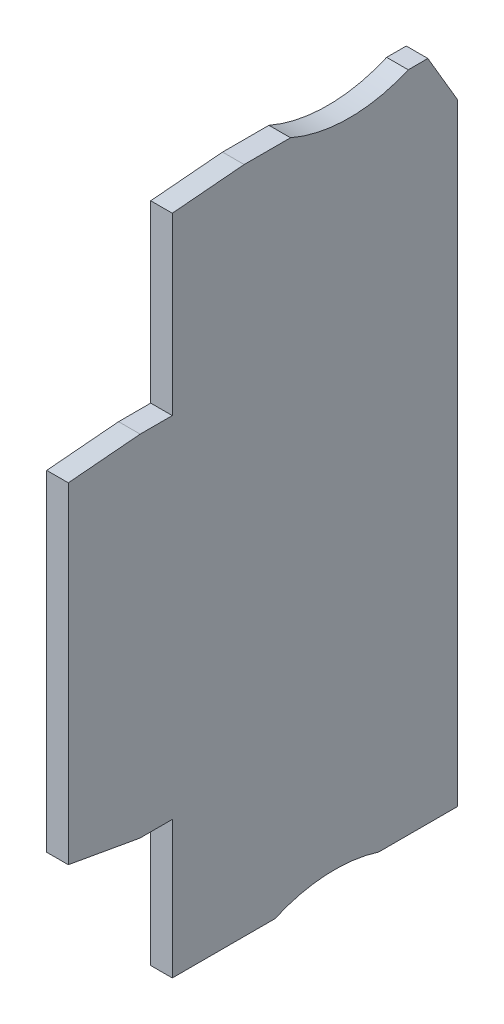
ISO-10303-21;
HEADER;
FILE_DESCRIPTION(('STEP AP214'),'2;1');
FILE_NAME('part.step','',(''),(''),'','','');
FILE_SCHEMA(('AUTOMOTIVE_DESIGN { 1 0 10303 214 1 1 1 1 }'));
ENDSEC;
DATA;
#1=APPLICATION_CONTEXT('core data for automotive mechanical design processes');
#2=APPLICATION_PROTOCOL_DEFINITION('international standard','automotive_design',2000,#1);
#3=PRODUCT_CONTEXT('',#1,'mechanical');
#4=PRODUCT('Part','Part','',(#3));
#5=PRODUCT_RELATED_PRODUCT_CATEGORY('part','',(#4));
#6=PRODUCT_DEFINITION_FORMATION('','',#4);
#7=PRODUCT_DEFINITION_CONTEXT('part definition',#1,'design');
#8=PRODUCT_DEFINITION('design','',#6,#7);
#9=PRODUCT_DEFINITION_SHAPE('','',#8);
#10=(LENGTH_UNIT() NAMED_UNIT(*) SI_UNIT(.MILLI.,.METRE.));
#11=(NAMED_UNIT(*) PLANE_ANGLE_UNIT() SI_UNIT($,.RADIAN.));
#12=(NAMED_UNIT(*) SI_UNIT($,.STERADIAN.) SOLID_ANGLE_UNIT());
#13=UNCERTAINTY_MEASURE_WITH_UNIT(LENGTH_MEASURE(1.E-05),#10,'distance_accuracy_value','');
#14=(GEOMETRIC_REPRESENTATION_CONTEXT(3) GLOBAL_UNCERTAINTY_ASSIGNED_CONTEXT((#13)) GLOBAL_UNIT_ASSIGNED_CONTEXT((#10,
#11,#12)) REPRESENTATION_CONTEXT('',''));
#15=CARTESIAN_POINT('',(0.,0.,0.));
#16=DIRECTION('',(0.,0.,1.));
#17=DIRECTION('',(1.,0.,0.));
#18=AXIS2_PLACEMENT_3D('',#15,#16,#17);
#19=CARTESIAN_POINT('',(-2.31752117496598E-10,7.14875595089332,37.2465441781817));
#20=DIRECTION('',(1.,0.,6.06602445926019E-12));
#21=DIRECTION('',(6.06602445926019E-12,-6.38508161535372E-12,-1.));
#22=AXIS2_PLACEMENT_3D('',#19,#20,#21);
#23=PLANE('',#22);
#24=DIRECTION('',(5.06826043643723E-12,-0.862158641431198,-0.506638408537599));
#25=VECTOR('',#24,1.);
#26=CARTESIAN_POINT('',(3.25434124093249E-12,63.5139647433493,0.275682717137429));
#27=LINE('',#26,#25);
#28=CARTESIAN_POINT('',(-2.7595981055839E-11,68.1499996769267,2.99999962101116));
#29=VERTEX_POINT('',#28);
#30=CARTESIAN_POINT('',(2.08166817117217E-12,63.0448289003726,-3.84241249928863E-13));
#31=VERTEX_POINT('',#30);
#32=EDGE_CURVE('E161',#29,#31,#27,.T.);
#33=ORIENTED_EDGE('',*,*,#32,.T.);
#34=DIRECTION('',(-6.06602445929903E-12,1.,0.));
#35=VECTOR('',#34,1.);
#36=CARTESIAN_POINT('',(3.48734929822569E-10,4.5999999999885,-2.60208521396521E-13));
#37=LINE('',#36,#35);
#38=CARTESIAN_POINT('',(2.46733189435133E-10,0.599999999988554,-2.60208521396521E-13));
#39=VERTEX_POINT('',#38);
#40=EDGE_CURVE('E166',#31,#39,#37,.F.);
#41=ORIENTED_EDGE('',*,*,#40,.T.);
#42=DIRECTION('',(3.18994706125859E-13,0.,1.));
#43=VECTOR('',#42,1.);
#44=CARTESIAN_POINT('',(-3.34454686168328E-12,0.599999999988665,7.70274641704755));
#45=LINE('',#44,#43);
#46=CARTESIAN_POINT('',(-4.38815650483093E-11,0.599999999988665,8.00000055935717));
#47=VERTEX_POINT('',#46);
#48=EDGE_CURVE('E174',#39,#47,#45,.T.);
#49=ORIENTED_EDGE('',*,*,#48,.T.);
#50=CARTESIAN_POINT('',(-8.30793767114812E-11,-13.7090883099887,12.4999996412768));
#51=DIRECTION('',(1.,0.,6.38501916531052E-12));
#52=DIRECTION('',(6.38501916531052E-12,-6.38508161535179E-12,-1.));
#53=AXIS2_PLACEMENT_3D('',#50,#51,#52);
#54=CIRCLE('',#53,15.);
#55=CARTESIAN_POINT('',(-1.01543773389778E-10,-4.05231403988182E-12,18.5877658743908));
#56=VERTEX_POINT('',#55);
#57=EDGE_CURVE('E232',#47,#56,#54,.T.);
#58=ORIENTED_EDGE('',*,*,#57,.T.);
#59=DIRECTION('',(3.18994706125859E-13,0.,1.));
#60=VECTOR('',#59,1.);
#61=CARTESIAN_POINT('',(-1.15359111152458E-10,-4.21884749357559E-12,28.5499996411571));
#62=LINE('',#61,#60);
#63=CARTESIAN_POINT('',(-1.37466427130306E-10,-4.21884749357559E-12,29.0499996411571));
#64=VERTEX_POINT('',#63);
#65=EDGE_CURVE('E179',#56,#64,#62,.T.);
#66=ORIENTED_EDGE('',*,*,#65,.T.);
#67=DIRECTION('',(-6.06602445929903E-12,1.,0.));
#68=VECTOR('',#67,1.);
#69=CARTESIAN_POINT('',(-2.66925370695503E-10,13.999999127783,29.049999641157));
#70=LINE('',#69,#68);
#71=CARTESIAN_POINT('',(-2.38621622461466E-10,13.999999127783,29.049999641157));
#72=VERTEX_POINT('',#71);
#73=EDGE_CURVE('E185',#64,#72,#70,.T.);
#74=ORIENTED_EDGE('',*,*,#73,.T.);
#75=DIRECTION('',(3.18994706125859E-13,0.,1.));
#76=VECTOR('',#75,1.);
#77=CARTESIAN_POINT('',(-1.80966353013901E-10,13.9999991277831,32.3615800476491));
#78=LINE('',#77,#76);
#79=CARTESIAN_POINT('',(-1.88002391432462E-10,13.9999991277829,32.3615800476491));
#80=VERTEX_POINT('',#79);
#81=EDGE_CURVE('E190',#72,#80,#78,.T.);
#82=ORIENTED_EDGE('',*,*,#81,.T.);
#83=DIRECTION('',(-7.4843751191772E-13,0.175156032776356,0.984540686910423));
#84=VECTOR('',#83,1.);
#85=CARTESIAN_POINT('',(-2.07292516485325E-10,15.223282714481,39.2375776575757));
#86=LINE('',#85,#84);
#87=CARTESIAN_POINT('',(-2.20504170478364E-10,15.2966552012047,39.6499996411875));
#88=VERTEX_POINT('',#87);
#89=EDGE_CURVE('E195',#80,#88,#86,.T.);
#90=ORIENTED_EDGE('',*,*,#89,.T.);
#91=DIRECTION('',(-6.06602445929903E-12,1.,0.));
#92=VECTOR('',#91,1.);
#93=CARTESIAN_POINT('',(-4.48051318269194E-10,48.5552805135887,39.6499996411875));
#94=LINE('',#93,#92);
#95=CARTESIAN_POINT('',(-3.82666121012676E-10,49.0137211985525,39.6499996411874));
#96=VERTEX_POINT('',#95);
#97=EDGE_CURVE('E200',#88,#96,#94,.T.);
#98=ORIENTED_EDGE('',*,*,#97,.T.);
#99=DIRECTION('',(-8.42872589628058E-13,0.0865600179668039,-0.996246637780819));
#100=VECTOR('',#99,1.);
#101=CARTESIAN_POINT('',(-2.525341047388E-10,49.6499996772699,32.3268692860397));
#102=LINE('',#101,#100);
#103=CARTESIAN_POINT('',(-2.35665653658401E-10,49.6499996772699,32.3268692860397));
#104=VERTEX_POINT('',#103);
#105=EDGE_CURVE('E205',#96,#104,#102,.T.);
#106=ORIENTED_EDGE('',*,*,#105,.T.);
#107=DIRECTION('',(-3.18994706125859E-13,0.,-1.));
#108=VECTOR('',#107,1.);
#109=CARTESIAN_POINT('',(-2.02976524477094E-10,49.64999967727,29.0499996411965));
#110=LINE('',#109,#108);
#111=CARTESIAN_POINT('',(-1.95975180528052E-10,49.64999967727,29.0499996411571));
#112=VERTEX_POINT('',#111);
#113=EDGE_CURVE('E210',#104,#112,#110,.T.);
#114=ORIENTED_EDGE('',*,*,#113,.T.);
#115=DIRECTION('',(-6.06602445929903E-12,1.,0.));
#116=VECTOR('',#115,1.);
#117=CARTESIAN_POINT('',(-2.87554702271819E-10,67.055280513241,29.049999641157));
#118=LINE('',#117,#116);
#119=CARTESIAN_POINT('',(-2.54234133745257E-10,67.5137211982072,29.0499996411571));
#120=VERTEX_POINT('',#119);
#121=EDGE_CURVE('E215',#112,#120,#118,.T.);
#122=ORIENTED_EDGE('',*,*,#121,.T.);
#123=DIRECTION('',(-8.42872589628378E-13,0.0865600179668569,-0.996246637780815));
#124=VECTOR('',#123,1.);
#125=CARTESIAN_POINT('',(-1.88231374931291E-10,68.1499996769293,21.7268692859681));
#126=LINE('',#125,#124);
#127=CARTESIAN_POINT('',(-1.71362923850893E-10,68.1499996769291,21.7268692859681));
#128=VERTEX_POINT('',#127);
#129=EDGE_CURVE('E220',#120,#128,#126,.T.);
#130=ORIENTED_EDGE('',*,*,#129,.T.);
#131=DIRECTION('',(-3.18994706125892E-13,0.,-1.));
#132=VECTOR('',#131,1.);
#133=CARTESIAN_POINT('',(-1.39013800470877E-10,68.1499996769286,17.4038337417028));
#134=LINE('',#133,#132);
#135=CARTESIAN_POINT('',(-1.04881381357558E-10,68.1499996769286,16.9999996067339));
#136=VERTEX_POINT('',#135);
#137=EDGE_CURVE('E127',#128,#136,#134,.T.);
#138=ORIENTED_EDGE('',*,*,#137,.T.);
#139=CARTESIAN_POINT('',(-7.25391968714462E-11,81.8977267768337,10.9999996411906));
#140=DIRECTION('',(1.,0.,6.38501916531052E-12));
#141=DIRECTION('',(6.38501916531052E-12,-6.38508161535179E-12,-1.));
#142=AXIS2_PLACEMENT_3D('',#139,#140,#141);
#143=CIRCLE('',#142,14.9999999999999);
#144=CARTESIAN_POINT('',(-5.43107225858819E-11,68.1499996769289,4.99999967564557));
#145=VERTEX_POINT('',#144);
#146=EDGE_CURVE('E19',#136,#145,#143,.T.);
#147=ORIENTED_EDGE('',*,*,#146,.T.);
#148=DIRECTION('',(-3.18994706125859E-13,0.,-1.));
#149=VECTOR('',#148,1.);
#150=CARTESIAN_POINT('',(-3.44377304450916E-11,68.1499996769289,4.14447945976649));
#151=LINE('',#150,#149);
#152=EDGE_CURVE('E130',#145,#29,#151,.T.);
#153=ORIENTED_EDGE('',*,*,#152,.T.);
#154=EDGE_LOOP('',(#33,#41,#49,#58,#66,#74,#82,#90,#98,#106,#114,#122,#130,#138,#147,#153));
#155=FACE_BOUND('',#154,.T.);
#156=ADVANCED_FACE('F16',(#155),#23,.F.);
#157=CARTESIAN_POINT('',(-2.29399832463173E-11,68.1499996769289,4.14447945976649));
#158=DIRECTION('',(0.,-1.,0.));
#159=DIRECTION('',(-3.18994706125859E-13,0.,-1.));
#160=AXIS2_PLACEMENT_3D('',#157,#158,#159);
#161=PLANE('',#160);
#162=DIRECTION('',(6.06602445926019E-12,-6.38508161535372E-12,-1.));
#163=VECTOR('',#162,1.);
#164=CARTESIAN_POINT('',(2.19999999976825,68.1499996771476,37.2465441778055));
#165=LINE('',#164,#163);
#166=CARTESIAN_POINT('',(2.19999999997599,68.149999676929,2.99999962102735));
#167=VERTEX_POINT('',#166);
#168=CARTESIAN_POINT('',(2.19999999996487,68.1499996769353,4.99999967564493));
#169=VERTEX_POINT('',#168);
#170=EDGE_CURVE('E154',#167,#169,#165,.F.);
#171=ORIENTED_EDGE('',*,*,#170,.F.);
#172=DIRECTION('',(1.,1.58065103624823E-12,7.31387203181941E-12));
#173=VECTOR('',#172,1.);
#174=CARTESIAN_POINT('',(-2.55143128846669E-11,68.1499996769256,2.99999962101116));
#175=LINE('',#174,#173);
#176=EDGE_CURVE('E140',#167,#29,#175,.F.);
#177=ORIENTED_EDGE('',*,*,#176,.T.);
#178=ORIENTED_EDGE('',*,*,#152,.F.);
#179=DIRECTION('',(1.,0.,6.38501916531052E-12));
#180=VECTOR('',#179,1.);
#181=CARTESIAN_POINT('',(-2.84355872182118E-11,68.1499996769289,4.9999996756456));
#182=LINE('',#181,#180);
#183=EDGE_CURVE('E135',#145,#169,#182,.T.);
#184=ORIENTED_EDGE('',*,*,#183,.T.);
#185=EDGE_LOOP('',(#171,#177,#178,#184));
#186=FACE_BOUND('',#185,.T.);
#187=ADVANCED_FACE('F137',(#186),#161,.F.);
#188=CARTESIAN_POINT('',(-6.67521593555875E-11,81.8977267768337,10.9999996411906));
#189=DIRECTION('',(1.,0.,6.38501916531052E-12));
#190=DIRECTION('',(6.38501916531052E-12,-6.38508161535179E-12,-1.));
#191=AXIS2_PLACEMENT_3D('',#188,#189,#190);
#192=CYLINDRICAL_SURFACE('',#191,14.9999999999999);
#193=CARTESIAN_POINT('',(2.19999999992751,81.8977267768337,10.9999996412046));
#194=DIRECTION('',(1.,0.,6.38501916531052E-12));
#195=DIRECTION('',(6.38501916531052E-12,-6.38508161535179E-12,-1.));
#196=AXIS2_PLACEMENT_3D('',#193,#194,#195);
#197=CIRCLE('',#196,14.9999999999999);
#198=CARTESIAN_POINT('',(2.19999999989016,68.1499996769285,16.9999996067403));
#199=VERTEX_POINT('',#198);
#200=EDGE_CURVE('E145',#169,#199,#197,.F.);
#201=ORIENTED_EDGE('',*,*,#200,.F.);
#202=ORIENTED_EDGE('',*,*,#183,.F.);
#203=ORIENTED_EDGE('',*,*,#146,.F.);
#204=DIRECTION('',(1.,0.,-3.18994706125892E-13));
#205=VECTOR('',#204,1.);
#206=CARTESIAN_POINT('',(-1.07733266752064E-10,68.1499996769286,16.9999996067329));
#207=LINE('',#206,#205);
#208=EDGE_CURVE('E148',#136,#199,#207,.T.);
#209=ORIENTED_EDGE('',*,*,#208,.T.);
#210=EDGE_LOOP('',(#201,#202,#203,#209));
#211=FACE_BOUND('',#210,.T.);
#212=ADVANCED_FACE('F143',(#211),#192,.F.);
#213=CARTESIAN_POINT('',(-1.07608366661793E-10,68.1499996769286,17.4038337417028));
#214=DIRECTION('',(0.,-1.,0.));
#215=DIRECTION('',(-3.18994706125892E-13,0.,-1.));
#216=AXIS2_PLACEMENT_3D('',#213,#214,#215);
#217=PLANE('',#216);
#218=DIRECTION('',(6.06602445926019E-12,-6.38508161535372E-12,-1.));
#219=VECTOR('',#218,1.);
#220=CARTESIAN_POINT('',(2.19999999976825,68.1499996770577,37.2465441778055));
#221=LINE('',#220,#219);
#222=CARTESIAN_POINT('',(2.1999999998624,68.1499996769493,21.7268692857541));
#223=VERTEX_POINT('',#222);
#224=EDGE_CURVE('E231',#199,#223,#221,.F.);
#225=ORIENTED_EDGE('',*,*,#224,.F.);
#226=ORIENTED_EDGE('',*,*,#208,.F.);
#227=ORIENTED_EDGE('',*,*,#137,.F.);
#228=DIRECTION('',(1.,6.23572004222197E-13,-7.91868354503638E-13));
#229=VECTOR('',#228,1.);
#230=CARTESIAN_POINT('',(-1.35232103293248E-10,68.1499996769293,21.7268692859681));
#231=LINE('',#230,#229);
#232=EDGE_CURVE('E217',#128,#223,#231,.T.);
#233=ORIENTED_EDGE('',*,*,#232,.T.);
#234=EDGE_LOOP('',(#225,#226,#227,#233));
#235=FACE_BOUND('',#234,.T.);
#236=ADVANCED_FACE('F312',(#235),#217,.F.);
#237=CARTESIAN_POINT('',(-1.35232103293248E-10,68.1499996769293,21.7268692859681));
#238=DIRECTION('',(5.52687373627387E-13,-0.996246637780815,-0.0865600179668569));
#239=DIRECTION('',(-8.42872589628378E-13,0.0865600179668569,-0.996246637780815));
#240=AXIS2_PLACEMENT_3D('',#237,#238,#239);
#241=PLANE('',#240);
#242=DIRECTION('',(-6.04436676338318E-12,-0.0865600179669249,0.996246637780808));
#243=VECTOR('',#242,1.);
#244=CARTESIAN_POINT('',(2.1999999998624,68.1499996769286,21.7268692859934));
#245=LINE('',#244,#243);
#246=CARTESIAN_POINT('',(2.19999999981797,67.5137211982117,29.0499996411711));
#247=VERTEX_POINT('',#246);
#248=EDGE_CURVE('E297',#223,#247,#245,.T.);
#249=ORIENTED_EDGE('',*,*,#248,.F.);
#250=ORIENTED_EDGE('',*,*,#232,.F.);
#251=ORIENTED_EDGE('',*,*,#129,.F.);
#252=DIRECTION('',(-1.,-6.06602445929903E-12,-6.38501916531052E-12));
#253=VECTOR('',#252,1.);
#254=CARTESIAN_POINT('',(-1.84734172403722E-10,67.513721198207,29.049999641157));
#255=LINE('',#254,#253);
#256=EDGE_CURVE('E212',#120,#247,#255,.F.);
#257=ORIENTED_EDGE('',*,*,#256,.T.);
#258=EDGE_LOOP('',(#249,#250,#251,#257));
#259=FACE_BOUND('',#258,.T.);
#260=ADVANCED_FACE('F316',(#259),#241,.F.);
#261=CARTESIAN_POINT('',(-1.81951675948255E-10,67.055280513241,29.049999641157));
#262=DIRECTION('',(6.38501916531052E-12,0.,-1.));
#263=DIRECTION('',(-1.,-6.06602445929903E-12,-6.38501916531052E-12));
#264=AXIS2_PLACEMENT_3D('',#261,#262,#263);
#265=PLANE('',#264);
#266=DIRECTION('',(0.,1.,-6.38508161535372E-12));
#267=VECTOR('',#266,1.);
#268=CARTESIAN_POINT('',(2.19999999981797,7.1487559508413,29.0499996415565));
#269=LINE('',#268,#267);
#270=CARTESIAN_POINT('',(2.19999999981797,49.6499996772695,29.0499996412422));
#271=VERTEX_POINT('',#270);
#272=EDGE_CURVE('E289',#247,#271,#269,.F.);
#273=ORIENTED_EDGE('',*,*,#272,.F.);
#274=ORIENTED_EDGE('',*,*,#256,.F.);
#275=ORIENTED_EDGE('',*,*,#121,.F.);
#276=DIRECTION('',(1.,0.,-3.18994706125859E-13));
#277=VECTOR('',#276,1.);
#278=CARTESIAN_POINT('',(-1.81979431523871E-10,49.64999967727,29.0499996411571));
#279=LINE('',#278,#277);
#280=EDGE_CURVE('E207',#112,#271,#279,.T.);
#281=ORIENTED_EDGE('',*,*,#280,.T.);
#282=EDGE_LOOP('',(#273,#274,#275,#281));
#283=FACE_BOUND('',#282,.T.);
#284=ADVANCED_FACE('F479',(#283),#265,.F.);
#285=CARTESIAN_POINT('',(-1.81979431523871E-10,49.64999967727,29.0499996411965));
#286=DIRECTION('',(0.,-1.,0.));
#287=DIRECTION('',(-3.18994706125859E-13,0.,-1.));
#288=AXIS2_PLACEMENT_3D('',#285,#286,#287);
#289=PLANE('',#288);
#290=DIRECTION('',(6.06602445926019E-12,-6.38508161535372E-12,-1.));
#291=VECTOR('',#290,1.);
#292=CARTESIAN_POINT('',(2.19999999976825,49.6499996773216,37.2465441779237));
#293=LINE('',#292,#291);
#294=CARTESIAN_POINT('',(2.19999999979809,49.6499996772839,32.3268692858896));
#295=VERTEX_POINT('',#294);
#296=EDGE_CURVE('E281',#271,#295,#293,.F.);
#297=ORIENTED_EDGE('',*,*,#296,.F.);
#298=ORIENTED_EDGE('',*,*,#280,.F.);
#299=ORIENTED_EDGE('',*,*,#113,.F.);
#300=DIRECTION('',(1.,6.23572004221788E-13,-7.91868354503382E-13));
#301=VECTOR('',#300,1.);
#302=CARTESIAN_POINT('',(-2.02927952219767E-10,49.6499996772699,32.3268692860397));
#303=LINE('',#302,#301);
#304=EDGE_CURVE('E202',#104,#295,#303,.T.);
#305=ORIENTED_EDGE('',*,*,#304,.T.);
#306=EDGE_LOOP('',(#297,#298,#299,#305));
#307=FACE_BOUND('',#306,.T.);
#308=ADVANCED_FACE('F469',(#307),#289,.F.);
#309=CARTESIAN_POINT('',(-2.02927952219767E-10,49.6499996772699,32.3268692860397));
#310=DIRECTION('',(5.52687373627048E-13,-0.996246637780819,-0.0865600179668039));
#311=DIRECTION('',(-8.42872589628058E-13,0.0865600179668039,-0.996246637780819));
#312=AXIS2_PLACEMENT_3D('',#309,#310,#311);
#313=PLANE('',#312);
#314=DIRECTION('',(-6.04342278872337E-12,-0.0865600179667748,0.996246637780822));
#315=VECTOR('',#314,1.);
#316=CARTESIAN_POINT('',(2.19999999979809,49.6499996772692,32.3268692860571));
#317=LINE('',#316,#315);
#318=CARTESIAN_POINT('',(2.19999999975368,49.0137211985567,39.6499996412015));
#319=VERTEX_POINT('',#318);
#320=EDGE_CURVE('E273',#295,#319,#317,.T.);
#321=ORIENTED_EDGE('',*,*,#320,.F.);
#322=ORIENTED_EDGE('',*,*,#304,.F.);
#323=ORIENTED_EDGE('',*,*,#105,.F.);
#324=DIRECTION('',(-1.,-6.06602445929903E-12,-6.38501916531052E-12));
#325=VECTOR('',#324,1.);
#326=CARTESIAN_POINT('',(-2.52436960224145E-10,49.0137211985527,39.6499996411875));
#327=LINE('',#326,#325);
#328=EDGE_CURVE('E197',#96,#319,#327,.F.);
#329=ORIENTED_EDGE('',*,*,#328,.T.);
#330=EDGE_LOOP('',(#321,#322,#323,#329));
#331=FACE_BOUND('',#330,.T.);
#332=ADVANCED_FACE('F459',(#331),#313,.F.);
#333=CARTESIAN_POINT('',(-2.49654463768678E-10,48.5552805135887,39.6499996411875));
#334=DIRECTION('',(6.38501916531052E-12,0.,-1.));
#335=DIRECTION('',(-1.,-6.06602445929903E-12,-6.38501916531052E-12));
#336=AXIS2_PLACEMENT_3D('',#333,#334,#335);
#337=PLANE('',#336);
#338=DIRECTION('',(0.,1.,-6.38508161535372E-12));
#339=VECTOR('',#338,1.);
#340=CARTESIAN_POINT('',(2.19999999975367,7.148755950909,39.6499996414688));
#341=LINE('',#340,#339);
#342=CARTESIAN_POINT('',(2.19999999975366,15.2966552012297,39.6499996413411));
#343=VERTEX_POINT('',#342);
#344=EDGE_CURVE('E265',#319,#343,#341,.F.);
#345=ORIENTED_EDGE('',*,*,#344,.F.);
#346=ORIENTED_EDGE('',*,*,#328,.F.);
#347=ORIENTED_EDGE('',*,*,#97,.F.);
#348=DIRECTION('',(1.,-9.69991977369987E-13,9.32757244782402E-13));
#349=VECTOR('',#348,1.);
#350=CARTESIAN_POINT('',(-2.47399323249908E-10,15.2966552012047,39.6499996411875));
#351=LINE('',#350,#349);
#352=EDGE_CURVE('E192',#88,#343,#351,.T.);
#353=ORIENTED_EDGE('',*,*,#352,.T.);
#354=EDGE_LOOP('',(#345,#346,#347,#353));
#355=FACE_BOUND('',#354,.T.);
#356=ADVANCED_FACE('F449',(#355),#337,.F.);
#357=CARTESIAN_POINT('',(-2.47087073024232E-10,15.223282714481,39.2375776575757));
#358=DIRECTION('',(1.11837462623694E-12,0.984540686910423,-0.175156032776356));
#359=DIRECTION('',(-7.4843751191772E-13,0.175156032776356,0.984540686910423));
#360=AXIS2_PLACEMENT_3D('',#357,#358,#359);
#361=PLANE('',#360);
#362=DIRECTION('',(5.97215392333813E-12,-0.175156032776407,-0.984540686910414));
#363=VECTOR('',#362,1.);
#364=CARTESIAN_POINT('',(2.19999999975367,15.296655201205,39.6499996412015));
#365=LINE('',#364,#363);
#366=CARTESIAN_POINT('',(2.19999999979788,13.9999991277827,32.3615800476582));
#367=VERTEX_POINT('',#366);
#368=EDGE_CURVE('E257',#343,#367,#365,.T.);
#369=ORIENTED_EDGE('',*,*,#368,.F.);
#370=ORIENTED_EDGE('',*,*,#352,.F.);
#371=ORIENTED_EDGE('',*,*,#89,.F.);
#372=DIRECTION('',(1.,0.,-3.18994706125859E-13));
#373=VECTOR('',#372,1.);
#374=CARTESIAN_POINT('',(-2.03170813506404E-10,13.9999991277831,32.3615800476491));
#375=LINE('',#374,#373);
#376=EDGE_CURVE('E187',#80,#367,#375,.T.);
#377=ORIENTED_EDGE('',*,*,#376,.T.);
#378=EDGE_LOOP('',(#369,#370,#371,#377));
#379=FACE_BOUND('',#378,.T.);
#380=ADVANCED_FACE('F439',(#379),#361,.F.);
#381=CARTESIAN_POINT('',(-2.03170813506404E-10,13.9999991277831,32.3615800476491));
#382=DIRECTION('',(0.,1.,0.));
#383=DIRECTION('',(3.18994706125859E-13,0.,1.));
#384=AXIS2_PLACEMENT_3D('',#381,#382,#383);
#385=PLANE('',#384);
#386=DIRECTION('',(6.06602445926019E-12,-6.38508161535372E-12,-1.));
#387=VECTOR('',#386,1.);
#388=CARTESIAN_POINT('',(2.19999999976825,13.9999991278136,37.2465441781513));
#389=LINE('',#388,#387);
#390=CARTESIAN_POINT('',(2.19999999981797,13.9999991277729,29.0499996411711));
#391=VERTEX_POINT('',#390);
#392=EDGE_CURVE('E249',#367,#391,#389,.T.);
#393=ORIENTED_EDGE('',*,*,#392,.F.);
#394=ORIENTED_EDGE('',*,*,#376,.F.);
#395=ORIENTED_EDGE('',*,*,#81,.F.);
#396=DIRECTION('',(-1.,-6.06602445929903E-12,-6.38501916531052E-12));
#397=VECTOR('',#396,1.);
#398=CARTESIAN_POINT('',(-1.82021064887294E-10,13.999999127783,29.049999641157));
#399=LINE('',#398,#397);
#400=EDGE_CURVE('E182',#72,#391,#399,.F.);
#401=ORIENTED_EDGE('',*,*,#400,.T.);
#402=EDGE_LOOP('',(#393,#394,#395,#401));
#403=FACE_BOUND('',#402,.T.);
#404=ADVANCED_FACE('F430',(#403),#385,.F.);
#405=CARTESIAN_POINT('',(-1.82021064887294E-10,13.999999127783,29.049999641157));
#406=DIRECTION('',(6.38501916531052E-12,0.,-1.));
#407=DIRECTION('',(-1.,-6.06602445929903E-12,-6.38501916531052E-12));
#408=AXIS2_PLACEMENT_3D('',#405,#406,#407);
#409=PLANE('',#408);
#410=DIRECTION('',(0.,1.,-6.38508161535372E-12));
#411=VECTOR('',#410,1.);
#412=CARTESIAN_POINT('',(2.19999999981797,7.1487559508413,29.0499996412148));
#413=LINE('',#412,#411);
#414=CARTESIAN_POINT('',(2.19999999981797,-3.91353616180368E-12,29.0499996412258));
#415=VERTEX_POINT('',#414);
#416=EDGE_CURVE('E246',#391,#415,#413,.F.);
#417=ORIENTED_EDGE('',*,*,#416,.F.);
#418=ORIENTED_EDGE('',*,*,#400,.F.);
#419=ORIENTED_EDGE('',*,*,#73,.F.);
#420=DIRECTION('',(1.,0.,-3.18994706125859E-13));
#421=VECTOR('',#420,1.);
#422=CARTESIAN_POINT('',(-1.78697334707323E-10,-4.21884749357559E-12,29.0499996411571));
#423=LINE('',#422,#421);
#424=EDGE_CURVE('E181',#64,#415,#423,.T.);
#425=ORIENTED_EDGE('',*,*,#424,.T.);
#426=EDGE_LOOP('',(#417,#418,#419,#425));
#427=FACE_BOUND('',#426,.T.);
#428=ADVANCED_FACE('F363',(#427),#409,.F.);
#429=CARTESIAN_POINT('',(-1.78856929267113E-10,-4.21884749357559E-12,28.5499996411571));
#430=DIRECTION('',(0.,1.,0.));
#431=DIRECTION('',(3.18994706125859E-13,0.,1.));
#432=AXIS2_PLACEMENT_3D('',#429,#430,#431);
#433=PLANE('',#432);
#434=DIRECTION('',(6.06602445926019E-12,-6.38508161535372E-12,-1.));
#435=VECTOR('',#434,1.);
#436=CARTESIAN_POINT('',(2.19999999976826,4.86277684785819E-11,37.2465441782407));
#437=LINE('',#436,#435);
#438=CARTESIAN_POINT('',(2.19999999988044,-3.72202269005584E-11,18.5877658744794));
#439=VERTEX_POINT('',#438);
#440=EDGE_CURVE('E230',#415,#439,#437,.T.);
#441=ORIENTED_EDGE('',*,*,#440,.F.);
#442=ORIENTED_EDGE('',*,*,#424,.F.);
#443=ORIENTED_EDGE('',*,*,#65,.F.);
#444=DIRECTION('',(1.,0.,6.38501916531052E-12));
#445=VECTOR('',#444,1.);
#446=CARTESIAN_POINT('',(-1.1518563880486E-10,-3.88578058618805E-12,18.5877658743904));
#447=LINE('',#446,#445);
#448=EDGE_CURVE('E176',#56,#439,#447,.T.);
#449=ORIENTED_EDGE('',*,*,#448,.T.);
#450=EDGE_LOOP('',(#441,#442,#443,#449));
#451=FACE_BOUND('',#450,.T.);
#452=ADVANCED_FACE('F351',(#451),#433,.F.);
#453=CARTESIAN_POINT('',(-7.63139551551717E-11,-13.7090883099887,12.4999996412768));
#454=DIRECTION('',(1.,0.,6.38501916531052E-12));
#455=DIRECTION('',(6.38501916531052E-12,-6.38508161535179E-12,-1.));
#456=AXIS2_PLACEMENT_3D('',#453,#454,#455);
#457=CYLINDRICAL_SURFACE('',#456,15.);
#458=CARTESIAN_POINT('',(2.19999999991834,-13.7090883099887,12.4999996412909));
#459=DIRECTION('',(1.,0.,6.38501916531052E-12));
#460=DIRECTION('',(6.38501916531052E-12,-6.38508161535179E-12,-1.));
#461=AXIS2_PLACEMENT_3D('',#458,#459,#460);
#462=CIRCLE('',#461,15.);
#463=CARTESIAN_POINT('',(2.19999999994636,0.599999999988277,8.00000055936267));
#464=VERTEX_POINT('',#463);
#465=EDGE_CURVE('E226',#439,#464,#462,.F.);
#466=ORIENTED_EDGE('',*,*,#465,.F.);
#467=ORIENTED_EDGE('',*,*,#448,.F.);
#468=ORIENTED_EDGE('',*,*,#57,.F.);
#469=DIRECTION('',(1.,0.,-3.18994706125859E-13));
#470=VECTOR('',#469,1.);
#471=CARTESIAN_POINT('',(-4.56509829938057E-11,0.599999999988693,8.00000055935625));
#472=LINE('',#471,#470);
#473=EDGE_CURVE('E168',#47,#464,#472,.T.);
#474=ORIENTED_EDGE('',*,*,#473,.T.);
#475=EDGE_LOOP('',(#466,#467,#468,#474));
#476=FACE_BOUND('',#475,.T.);
#477=ADVANCED_FACE('F354',(#476),#457,.F.);
#478=CARTESIAN_POINT('',(-4.57481275084604E-11,0.599999999988665,7.70274641704755));
#479=DIRECTION('',(0.,1.,0.));
#480=DIRECTION('',(3.18994706125859E-13,0.,1.));
#481=AXIS2_PLACEMENT_3D('',#478,#479,#480);
#482=PLANE('',#481);
#483=DIRECTION('',(6.06602445926019E-12,-6.38508161535372E-12,-1.));
#484=VECTOR('',#483,1.);
#485=CARTESIAN_POINT('',(2.19999999976825,0.600000000174655,37.2465441782369));
#486=LINE('',#485,#484);
#487=CARTESIAN_POINT('',(2.19999999999419,0.599999999958495,1.37819443357667E-11));
#488=VERTEX_POINT('',#487);
#489=EDGE_CURVE('E229',#464,#488,#486,.T.);
#490=ORIENTED_EDGE('',*,*,#489,.F.);
#491=ORIENTED_EDGE('',*,*,#473,.F.);
#492=ORIENTED_EDGE('',*,*,#48,.F.);
#493=DIRECTION('',(1.,6.06602445929903E-12,6.38501916531052E-12));
#494=VECTOR('',#493,1.);
#495=CARTESIAN_POINT('',(2.77972089790524E-11,0.599999999988499,-2.60208521396521E-13));
#496=LINE('',#495,#494);
#497=EDGE_CURVE('E163',#39,#488,#496,.T.);
#498=ORIENTED_EDGE('',*,*,#497,.T.);
#499=EDGE_LOOP('',(#490,#491,#492,#498));
#500=FACE_BOUND('',#499,.T.);
#501=ADVANCED_FACE('F341',(#500),#482,.F.);
#502=CARTESIAN_POINT('',(3.53189699708878E-12,4.5999999999885,-2.60208521396521E-13));
#503=DIRECTION('',(-6.38501916531052E-12,0.,1.));
#504=DIRECTION('',(1.,6.06602445929903E-12,6.38501916531052E-12));
#505=AXIS2_PLACEMENT_3D('',#502,#503,#504);
#506=PLANE('',#505);
#507=DIRECTION('',(0.,1.,-6.38508161535372E-12));
#508=VECTOR('',#507,1.);
#509=CARTESIAN_POINT('',(2.19999999999419,7.14875595065581,-2.80344324143922E-11));
#510=LINE('',#509,#508);
#511=CARTESIAN_POINT('',(2.1999999998048,63.044828900204,-8.54277586170848E-11));
#512=VERTEX_POINT('',#511);
#513=EDGE_CURVE('E25',#488,#512,#510,.T.);
#514=ORIENTED_EDGE('',*,*,#513,.F.);
#515=ORIENTED_EDGE('',*,*,#497,.F.);
#516=ORIENTED_EDGE('',*,*,#40,.F.);
#517=DIRECTION('',(1.,1.58065103624823E-12,7.31387203181941E-12));
#518=VECTOR('',#517,1.);
#519=CARTESIAN_POINT('',(4.49640324973188E-12,63.0448289003726,-4.46691295064028E-13));
#520=LINE('',#519,#518);
#521=EDGE_CURVE('E34',#31,#512,#520,.T.);
#522=ORIENTED_EDGE('',*,*,#521,.T.);
#523=EDGE_LOOP('',(#514,#515,#516,#522));
#524=FACE_BOUND('',#523,.T.);
#525=ADVANCED_FACE('F344',(#524),#506,.F.);
#526=CARTESIAN_POINT('',(1.74166236988071E-12,63.5139647433493,0.275682717137429));
#527=DIRECTION('',(-5.50489944909694E-12,-0.506638408537599,0.862158641431198));
#528=DIRECTION('',(5.06826043643723E-12,-0.862158641431198,-0.506638408537599));
#529=AXIS2_PLACEMENT_3D('',#526,#527,#528);
#530=PLANE('',#529);
#531=DIRECTION('',(-3.07262224762349E-12,0.862158641431184,0.506638408537622));
#532=VECTOR('',#531,1.);
#533=CARTESIAN_POINT('',(2.19999999999419,63.0448289003728,1.37732707183869E-11));
#534=LINE('',#533,#532);
#535=EDGE_CURVE('E11',#512,#167,#534,.T.);
#536=ORIENTED_EDGE('',*,*,#535,.F.);
#537=ORIENTED_EDGE('',*,*,#521,.F.);
#538=ORIENTED_EDGE('',*,*,#32,.F.);
#539=ORIENTED_EDGE('',*,*,#176,.F.);
#540=EDGE_LOOP('',(#536,#537,#538,#539));
#541=FACE_BOUND('',#540,.T.);
#542=ADVANCED_FACE('F366',(#541),#530,.F.);
#543=CARTESIAN_POINT('',(2.19999999976825,7.14875595089365,37.246544178195));
#544=DIRECTION('',(1.,0.,6.06602445926019E-12));
#545=DIRECTION('',(6.06602445926019E-12,-6.38508161535372E-12,-1.));
#546=AXIS2_PLACEMENT_3D('',#543,#544,#545);
#547=PLANE('',#546);
#548=ORIENTED_EDGE('',*,*,#513,.T.);
#549=ORIENTED_EDGE('',*,*,#535,.T.);
#550=ORIENTED_EDGE('',*,*,#170,.T.);
#551=ORIENTED_EDGE('',*,*,#200,.T.);
#552=ORIENTED_EDGE('',*,*,#224,.T.);
#553=ORIENTED_EDGE('',*,*,#248,.T.);
#554=ORIENTED_EDGE('',*,*,#272,.T.);
#555=ORIENTED_EDGE('',*,*,#296,.T.);
#556=ORIENTED_EDGE('',*,*,#320,.T.);
#557=ORIENTED_EDGE('',*,*,#344,.T.);
#558=ORIENTED_EDGE('',*,*,#368,.T.);
#559=ORIENTED_EDGE('',*,*,#392,.T.);
#560=ORIENTED_EDGE('',*,*,#416,.T.);
#561=ORIENTED_EDGE('',*,*,#440,.T.);
#562=ORIENTED_EDGE('',*,*,#465,.T.);
#563=ORIENTED_EDGE('',*,*,#489,.T.);
#564=EDGE_LOOP('',(#548,#549,#550,#551,#552,#553,#554,#555,#556,#557,#558,#559,#560,#561,#562,#563));
#565=FACE_BOUND('',#564,.T.);
#566=ADVANCED_FACE('F321',(#565),#547,.T.);
#567=CLOSED_SHELL('',(#156,#187,#212,#236,#260,#284,#308,#332,#356,#380,#404,#428,#452,#477,
#501,#525,#542,#566));
#568=MANIFOLD_SOLID_BREP('B1',#567);
#569=ADVANCED_BREP_SHAPE_REPRESENTATION('',(#18,#568),#14);
#570=SHAPE_DEFINITION_REPRESENTATION(#9,#569);
ENDSEC;
END-ISO-10303-21;
